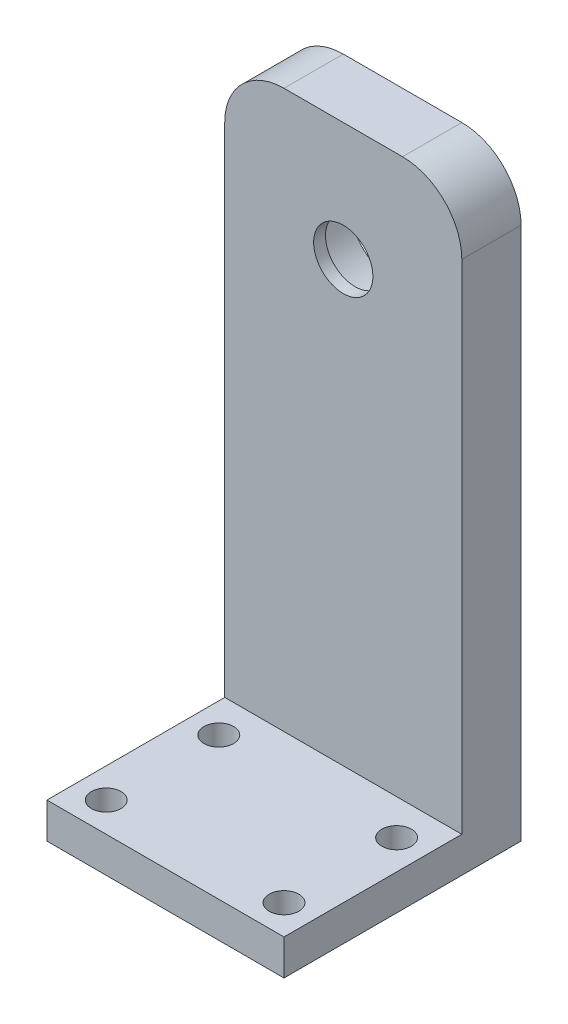
ISO-10303-21;
HEADER;
FILE_DESCRIPTION(('STEP AP214'),'2;1');
FILE_NAME('part.step','',(''),(''),'','','');
FILE_SCHEMA(('AUTOMOTIVE_DESIGN { 1 0 10303 214 1 1 1 1 }'));
ENDSEC;
DATA;
#1=APPLICATION_CONTEXT('core data for automotive mechanical design processes');
#2=APPLICATION_PROTOCOL_DEFINITION('international standard','automotive_design',2000,#1);
#3=PRODUCT_CONTEXT('',#1,'mechanical');
#4=PRODUCT('Part','Part','',(#3));
#5=PRODUCT_RELATED_PRODUCT_CATEGORY('part','',(#4));
#6=PRODUCT_DEFINITION_FORMATION('','',#4);
#7=PRODUCT_DEFINITION_CONTEXT('part definition',#1,'design');
#8=PRODUCT_DEFINITION('design','',#6,#7);
#9=PRODUCT_DEFINITION_SHAPE('','',#8);
#10=(LENGTH_UNIT() NAMED_UNIT(*) SI_UNIT(.MILLI.,.METRE.));
#11=(NAMED_UNIT(*) PLANE_ANGLE_UNIT() SI_UNIT($,.RADIAN.));
#12=(NAMED_UNIT(*) SI_UNIT($,.STERADIAN.) SOLID_ANGLE_UNIT());
#13=UNCERTAINTY_MEASURE_WITH_UNIT(LENGTH_MEASURE(1.E-05),#10,'distance_accuracy_value','');
#14=(GEOMETRIC_REPRESENTATION_CONTEXT(3) GLOBAL_UNCERTAINTY_ASSIGNED_CONTEXT((#13)) GLOBAL_UNIT_ASSIGNED_CONTEXT((#10,
#11,#12)) REPRESENTATION_CONTEXT('',''));
#15=CARTESIAN_POINT('',(0.,0.,0.));
#16=DIRECTION('',(0.,0.,1.));
#17=DIRECTION('',(1.,0.,0.));
#18=AXIS2_PLACEMENT_3D('',#15,#16,#17);
#19=CARTESIAN_POINT('',(0.,72.,0.));
#20=DIRECTION('',(0.,0.,1.));
#21=DIRECTION('',(1.,0.,0.));
#22=AXIS2_PLACEMENT_3D('',#19,#20,#21);
#23=CYLINDRICAL_SURFACE('',#22,9.5);
#24=CARTESIAN_POINT('',(0.,72.,0.));
#25=DIRECTION('',(0.,0.,1.));
#26=DIRECTION('',(1.,0.,0.));
#27=AXIS2_PLACEMENT_3D('',#24,#25,#26);
#28=CIRCLE('',#27,9.5);
#29=CARTESIAN_POINT('',(9.49999999999999,72.,0.));
#30=VERTEX_POINT('',#29);
#31=EDGE_CURVE('E179',#30,#30,#28,.T.);
#32=ORIENTED_EDGE('',*,*,#31,.F.);
#33=EDGE_LOOP('',(#32));
#34=FACE_BOUND('',#33,.T.);
#35=CARTESIAN_POINT('',(0.,72.,8.));
#36=DIRECTION('',(0.,0.,1.));
#37=DIRECTION('',(1.,0.,0.));
#38=AXIS2_PLACEMENT_3D('',#35,#36,#37);
#39=CIRCLE('',#38,9.5);
#40=CARTESIAN_POINT('',(9.49999999999999,72.,8.));
#41=VERTEX_POINT('',#40);
#42=EDGE_CURVE('E11',#41,#41,#39,.F.);
#43=ORIENTED_EDGE('',*,*,#42,.F.);
#44=EDGE_LOOP('',(#43));
#45=FACE_BOUND('',#44,.T.);
#46=ADVANCED_FACE('F33',(#34,#45),#23,.F.);
#47=CARTESIAN_POINT('',(-20.,15.,10.));
#48=DIRECTION('',(1.,0.,0.));
#49=DIRECTION('',(0.,1.,0.));
#50=AXIS2_PLACEMENT_3D('',#47,#48,#49);
#51=PLANE('',#50);
#52=DIRECTION('',(0.,-1.,0.));
#53=VECTOR('',#52,1.);
#54=CARTESIAN_POINT('',(-20.,15.,10.));
#55=LINE('',#54,#53);
#56=CARTESIAN_POINT('',(-20.,82.,10.));
#57=VERTEX_POINT('',#56);
#58=CARTESIAN_POINT('',(-20.,-2.,10.));
#59=VERTEX_POINT('',#58);
#60=EDGE_CURVE('E121',#57,#59,#55,.T.);
#61=ORIENTED_EDGE('',*,*,#60,.F.);
#62=DIRECTION('',(0.,0.,-1.));
#63=VECTOR('',#62,1.);
#64=CARTESIAN_POINT('',(-20.,82.,0.));
#65=LINE('',#64,#63);
#66=CARTESIAN_POINT('',(-20.,82.,0.));
#67=VERTEX_POINT('',#66);
#68=EDGE_CURVE('E145',#57,#67,#65,.T.);
#69=ORIENTED_EDGE('',*,*,#68,.T.);
#70=DIRECTION('',(0.,-1.,0.));
#71=VECTOR('',#70,1.);
#72=CARTESIAN_POINT('',(-20.,15.,0.));
#73=LINE('',#72,#71);
#74=CARTESIAN_POINT('',(-20.,-8.,0.));
#75=VERTEX_POINT('',#74);
#76=EDGE_CURVE('E122',#67,#75,#73,.T.);
#77=ORIENTED_EDGE('',*,*,#76,.T.);
#78=DIRECTION('',(0.,0.,1.));
#79=VECTOR('',#78,1.);
#80=CARTESIAN_POINT('',(-20.,-8.,0.));
#81=LINE('',#80,#79);
#82=CARTESIAN_POINT('',(-20.,-8.,40.));
#83=VERTEX_POINT('',#82);
#84=EDGE_CURVE('E106',#75,#83,#81,.T.);
#85=ORIENTED_EDGE('',*,*,#84,.T.);
#86=DIRECTION('',(0.,-1.,0.));
#87=VECTOR('',#86,1.);
#88=CARTESIAN_POINT('',(-20.,-10.,40.));
#89=LINE('',#88,#87);
#90=CARTESIAN_POINT('',(-20.,-2.,40.));
#91=VERTEX_POINT('',#90);
#92=EDGE_CURVE('E199',#91,#83,#89,.T.);
#93=ORIENTED_EDGE('',*,*,#92,.F.);
#94=DIRECTION('',(0.,0.,-1.));
#95=VECTOR('',#94,1.);
#96=CARTESIAN_POINT('',(-20.,-2.,40.));
#97=LINE('',#96,#95);
#98=EDGE_CURVE('E172',#91,#59,#97,.T.);
#99=ORIENTED_EDGE('',*,*,#98,.T.);
#100=EDGE_LOOP('',(#61,#69,#77,#85,#93,#99));
#101=FACE_BOUND('',#100,.T.);
#102=ADVANCED_FACE('F169',(#101),#51,.F.);
#103=CARTESIAN_POINT('',(20.,15.,10.));
#104=DIRECTION('',(-1.,0.,0.));
#105=DIRECTION('',(0.,-1.,0.));
#106=AXIS2_PLACEMENT_3D('',#103,#104,#105);
#107=PLANE('',#106);
#108=DIRECTION('',(0.,1.,0.));
#109=VECTOR('',#108,1.);
#110=CARTESIAN_POINT('',(20.,15.,0.));
#111=LINE('',#110,#109);
#112=CARTESIAN_POINT('',(20.,-8.,0.));
#113=VERTEX_POINT('',#112);
#114=CARTESIAN_POINT('',(20.,82.,0.));
#115=VERTEX_POINT('',#114);
#116=EDGE_CURVE('E114',#113,#115,#111,.T.);
#117=ORIENTED_EDGE('',*,*,#116,.T.);
#118=DIRECTION('',(0.,0.,-1.));
#119=VECTOR('',#118,1.);
#120=CARTESIAN_POINT('',(20.,82.,9.99999999999999));
#121=LINE('',#120,#119);
#122=CARTESIAN_POINT('',(20.,82.,10.));
#123=VERTEX_POINT('',#122);
#124=EDGE_CURVE('E41',#115,#123,#121,.F.);
#125=ORIENTED_EDGE('',*,*,#124,.T.);
#126=DIRECTION('',(0.,1.,0.));
#127=VECTOR('',#126,1.);
#128=CARTESIAN_POINT('',(20.,15.,10.));
#129=LINE('',#128,#127);
#130=CARTESIAN_POINT('',(20.,-2.,10.));
#131=VERTEX_POINT('',#130);
#132=EDGE_CURVE('E124',#131,#123,#129,.T.);
#133=ORIENTED_EDGE('',*,*,#132,.F.);
#134=DIRECTION('',(0.,0.,-1.));
#135=VECTOR('',#134,1.);
#136=CARTESIAN_POINT('',(20.,-2.,40.));
#137=LINE('',#136,#135);
#138=CARTESIAN_POINT('',(20.,-2.,40.));
#139=VERTEX_POINT('',#138);
#140=EDGE_CURVE('E126',#139,#131,#137,.T.);
#141=ORIENTED_EDGE('',*,*,#140,.F.);
#142=DIRECTION('',(0.,1.,0.));
#143=VECTOR('',#142,1.);
#144=CARTESIAN_POINT('',(20.,-10.,40.));
#145=LINE('',#144,#143);
#146=CARTESIAN_POINT('',(20.,-8.,40.));
#147=VERTEX_POINT('',#146);
#148=EDGE_CURVE('E116',#147,#139,#145,.T.);
#149=ORIENTED_EDGE('',*,*,#148,.F.);
#150=DIRECTION('',(0.,0.,1.));
#151=VECTOR('',#150,1.);
#152=CARTESIAN_POINT('',(20.,-8.,0.));
#153=LINE('',#152,#151);
#154=EDGE_CURVE('E104',#113,#147,#153,.T.);
#155=ORIENTED_EDGE('',*,*,#154,.F.);
#156=EDGE_LOOP('',(#117,#125,#133,#141,#149,#155));
#157=FACE_BOUND('',#156,.T.);
#158=ADVANCED_FACE('F113',(#157),#107,.F.);
#159=CARTESIAN_POINT('',(0.,0.,10.));
#160=DIRECTION('',(0.,0.,1.));
#161=DIRECTION('',(1.,0.,0.));
#162=AXIS2_PLACEMENT_3D('',#159,#160,#161);
#163=PLANE('',#162);
#164=DIRECTION('',(1.,0.,0.));
#165=VECTOR('',#164,1.);
#166=CARTESIAN_POINT('',(20.,92.,9.99999999999999));
#167=LINE('',#166,#165);
#168=CARTESIAN_POINT('',(-10.,92.,9.99999999999999));
#169=VERTEX_POINT('',#168);
#170=CARTESIAN_POINT('',(9.99999999999998,92.,9.99999999999999));
#171=VERTEX_POINT('',#170);
#172=EDGE_CURVE('E163',#169,#171,#167,.T.);
#173=ORIENTED_EDGE('',*,*,#172,.F.);
#174=CARTESIAN_POINT('',(-10.,82.,10.));
#175=DIRECTION('',(0.,0.,1.));
#176=DIRECTION('',(1.,0.,0.));
#177=AXIS2_PLACEMENT_3D('',#174,#175,#176);
#178=CIRCLE('',#177,10.);
#179=EDGE_CURVE('E157',#169,#57,#178,.T.);
#180=ORIENTED_EDGE('',*,*,#179,.T.);
#181=ORIENTED_EDGE('',*,*,#60,.T.);
#182=DIRECTION('',(-1.,0.,0.));
#183=VECTOR('',#182,1.);
#184=CARTESIAN_POINT('',(-20.,-2.,10.));
#185=LINE('',#184,#183);
#186=EDGE_CURVE('E197',#131,#59,#185,.T.);
#187=ORIENTED_EDGE('',*,*,#186,.F.);
#188=ORIENTED_EDGE('',*,*,#132,.T.);
#189=CARTESIAN_POINT('',(9.99999999999998,82.,9.99999999999999));
#190=DIRECTION('',(0.,0.,1.));
#191=DIRECTION('',(1.,0.,0.));
#192=AXIS2_PLACEMENT_3D('',#189,#190,#191);
#193=CIRCLE('',#192,10.);
#194=EDGE_CURVE('E54',#123,#171,#193,.T.);
#195=ORIENTED_EDGE('',*,*,#194,.T.);
#196=EDGE_LOOP('',(#173,#180,#181,#187,#188,#195));
#197=FACE_BOUND('',#196,.T.);
#198=CARTESIAN_POINT('',(0.,72.,10.));
#199=DIRECTION('',(0.,0.,1.));
#200=DIRECTION('',(1.,0.,0.));
#201=AXIS2_PLACEMENT_3D('',#198,#199,#200);
#202=CIRCLE('',#201,5.);
#203=CARTESIAN_POINT('',(5.,72.,10.));
#204=VERTEX_POINT('',#203);
#205=EDGE_CURVE('E349',#204,#204,#202,.T.);
#206=ORIENTED_EDGE('',*,*,#205,.F.);
#207=EDGE_LOOP('',(#206));
#208=FACE_BOUND('',#207,.T.);
#209=ADVANCED_FACE('F160',(#197,#208),#163,.T.);
#210=CARTESIAN_POINT('',(0.,0.,0.));
#211=DIRECTION('',(0.,0.,1.));
#212=DIRECTION('',(1.,0.,0.));
#213=AXIS2_PLACEMENT_3D('',#210,#211,#212);
#214=PLANE('',#213);
#215=ORIENTED_EDGE('',*,*,#31,.T.);
#216=EDGE_LOOP('',(#215));
#217=FACE_BOUND('',#216,.T.);
#218=ORIENTED_EDGE('',*,*,#76,.F.);
#219=CARTESIAN_POINT('',(-10.,82.,0.));
#220=DIRECTION('',(0.,0.,1.));
#221=DIRECTION('',(1.,0.,0.));
#222=AXIS2_PLACEMENT_3D('',#219,#220,#221);
#223=CIRCLE('',#222,10.);
#224=CARTESIAN_POINT('',(-10.,92.,0.));
#225=VERTEX_POINT('',#224);
#226=EDGE_CURVE('E149',#67,#225,#223,.F.);
#227=ORIENTED_EDGE('',*,*,#226,.T.);
#228=DIRECTION('',(1.,0.,0.));
#229=VECTOR('',#228,1.);
#230=CARTESIAN_POINT('',(20.,92.,0.));
#231=LINE('',#230,#229);
#232=CARTESIAN_POINT('',(9.99999999999998,92.,0.));
#233=VERTEX_POINT('',#232);
#234=EDGE_CURVE('E175',#225,#233,#231,.T.);
#235=ORIENTED_EDGE('',*,*,#234,.T.);
#236=CARTESIAN_POINT('',(9.99999999999998,82.,0.));
#237=DIRECTION('',(0.,0.,1.));
#238=DIRECTION('',(1.,0.,0.));
#239=AXIS2_PLACEMENT_3D('',#236,#237,#238);
#240=CIRCLE('',#239,10.);
#241=EDGE_CURVE('E120',#233,#115,#240,.F.);
#242=ORIENTED_EDGE('',*,*,#241,.T.);
#243=ORIENTED_EDGE('',*,*,#116,.F.);
#244=DIRECTION('',(-1.,0.,0.));
#245=VECTOR('',#244,1.);
#246=CARTESIAN_POINT('',(-20.,-8.,0.));
#247=LINE('',#246,#245);
#248=EDGE_CURVE('E100',#113,#75,#247,.T.);
#249=ORIENTED_EDGE('',*,*,#248,.T.);
#250=EDGE_LOOP('',(#218,#227,#235,#242,#243,#249));
#251=FACE_BOUND('',#250,.T.);
#252=ADVANCED_FACE('F118',(#217,#251),#214,.F.);
#253=CARTESIAN_POINT('',(-20.,-2.,40.));
#254=DIRECTION('',(0.,-1.,0.));
#255=DIRECTION('',(0.,0.,-1.));
#256=AXIS2_PLACEMENT_3D('',#253,#254,#255);
#257=PLANE('',#256);
#258=CARTESIAN_POINT('',(-15.,-2.,16.));
#259=DIRECTION('',(0.,1.,0.));
#260=DIRECTION('',(0.,0.,1.));
#261=AXIS2_PLACEMENT_3D('',#258,#259,#260);
#262=CIRCLE('',#261,2.5);
#263=CARTESIAN_POINT('',(-15.,-2.,18.5));
#264=VERTEX_POINT('',#263);
#265=EDGE_CURVE('E141',#264,#264,#262,.T.);
#266=ORIENTED_EDGE('',*,*,#265,.F.);
#267=EDGE_LOOP('',(#266));
#268=FACE_BOUND('',#267,.T.);
#269=CARTESIAN_POINT('',(15.,-2.,16.));
#270=DIRECTION('',(0.,1.,0.));
#271=DIRECTION('',(0.,0.,1.));
#272=AXIS2_PLACEMENT_3D('',#269,#270,#271);
#273=CIRCLE('',#272,2.5);
#274=CARTESIAN_POINT('',(15.,-2.,18.5));
#275=VERTEX_POINT('',#274);
#276=EDGE_CURVE('E181',#275,#275,#273,.T.);
#277=ORIENTED_EDGE('',*,*,#276,.F.);
#278=EDGE_LOOP('',(#277));
#279=FACE_BOUND('',#278,.T.);
#280=CARTESIAN_POINT('',(-15.,-2.,35.));
#281=DIRECTION('',(0.,1.,0.));
#282=DIRECTION('',(0.,0.,1.));
#283=AXIS2_PLACEMENT_3D('',#280,#281,#282);
#284=CIRCLE('',#283,2.5);
#285=CARTESIAN_POINT('',(-15.,-2.,37.5));
#286=VERTEX_POINT('',#285);
#287=EDGE_CURVE('E134',#286,#286,#284,.T.);
#288=ORIENTED_EDGE('',*,*,#287,.F.);
#289=EDGE_LOOP('',(#288));
#290=FACE_BOUND('',#289,.T.);
#291=CARTESIAN_POINT('',(15.,-2.,35.));
#292=DIRECTION('',(0.,1.,0.));
#293=DIRECTION('',(0.,0.,1.));
#294=AXIS2_PLACEMENT_3D('',#291,#292,#293);
#295=CIRCLE('',#294,2.5);
#296=CARTESIAN_POINT('',(15.,-2.,37.5));
#297=VERTEX_POINT('',#296);
#298=EDGE_CURVE('E144',#297,#297,#295,.T.);
#299=ORIENTED_EDGE('',*,*,#298,.F.);
#300=EDGE_LOOP('',(#299));
#301=FACE_BOUND('',#300,.T.);
#302=ORIENTED_EDGE('',*,*,#186,.T.);
#303=ORIENTED_EDGE('',*,*,#98,.F.);
#304=DIRECTION('',(-1.,0.,0.));
#305=VECTOR('',#304,1.);
#306=CARTESIAN_POINT('',(-20.,-2.,40.));
#307=LINE('',#306,#305);
#308=EDGE_CURVE('E203',#139,#91,#307,.T.);
#309=ORIENTED_EDGE('',*,*,#308,.F.);
#310=ORIENTED_EDGE('',*,*,#140,.T.);
#311=EDGE_LOOP('',(#302,#303,#309,#310));
#312=FACE_BOUND('',#311,.T.);
#313=ADVANCED_FACE('F253',(#268,#279,#290,#301,#312),#257,.F.);
#314=CARTESIAN_POINT('',(0.,0.,40.));
#315=DIRECTION('',(0.,0.,-1.));
#316=DIRECTION('',(-1.,0.,0.));
#317=AXIS2_PLACEMENT_3D('',#314,#315,#316);
#318=PLANE('',#317);
#319=ORIENTED_EDGE('',*,*,#92,.T.);
#320=DIRECTION('',(-1.,0.,0.));
#321=VECTOR('',#320,1.);
#322=CARTESIAN_POINT('',(-20.,-8.,40.));
#323=LINE('',#322,#321);
#324=EDGE_CURVE('E110',#147,#83,#323,.T.);
#325=ORIENTED_EDGE('',*,*,#324,.F.);
#326=ORIENTED_EDGE('',*,*,#148,.T.);
#327=ORIENTED_EDGE('',*,*,#308,.T.);
#328=EDGE_LOOP('',(#319,#325,#326,#327));
#329=FACE_BOUND('',#328,.T.);
#330=ADVANCED_FACE('F249',(#329),#318,.F.);
#331=CARTESIAN_POINT('',(-20.,-8.,0.));
#332=DIRECTION('',(0.,1.,0.));
#333=DIRECTION('',(0.,0.,1.));
#334=AXIS2_PLACEMENT_3D('',#331,#332,#333);
#335=PLANE('',#334);
#336=CARTESIAN_POINT('',(-15.,-8.,16.));
#337=DIRECTION('',(0.,1.,0.));
#338=DIRECTION('',(0.,0.,1.));
#339=AXIS2_PLACEMENT_3D('',#336,#337,#338);
#340=CIRCLE('',#339,2.5);
#341=CARTESIAN_POINT('',(-15.,-8.,18.5));
#342=VERTEX_POINT('',#341);
#343=EDGE_CURVE('E140',#342,#342,#340,.T.);
#344=ORIENTED_EDGE('',*,*,#343,.T.);
#345=EDGE_LOOP('',(#344));
#346=FACE_BOUND('',#345,.T.);
#347=CARTESIAN_POINT('',(15.,-8.,16.));
#348=DIRECTION('',(0.,1.,0.));
#349=DIRECTION('',(0.,0.,1.));
#350=AXIS2_PLACEMENT_3D('',#347,#348,#349);
#351=CIRCLE('',#350,2.5);
#352=CARTESIAN_POINT('',(15.,-8.,18.5));
#353=VERTEX_POINT('',#352);
#354=EDGE_CURVE('E137',#353,#353,#351,.T.);
#355=ORIENTED_EDGE('',*,*,#354,.T.);
#356=EDGE_LOOP('',(#355));
#357=FACE_BOUND('',#356,.T.);
#358=CARTESIAN_POINT('',(-15.,-8.,35.));
#359=DIRECTION('',(0.,1.,0.));
#360=DIRECTION('',(0.,0.,1.));
#361=AXIS2_PLACEMENT_3D('',#358,#359,#360);
#362=CIRCLE('',#361,2.5);
#363=CARTESIAN_POINT('',(-15.,-8.,37.5));
#364=VERTEX_POINT('',#363);
#365=EDGE_CURVE('E133',#364,#364,#362,.T.);
#366=ORIENTED_EDGE('',*,*,#365,.T.);
#367=EDGE_LOOP('',(#366));
#368=FACE_BOUND('',#367,.T.);
#369=CARTESIAN_POINT('',(15.,-8.,35.));
#370=DIRECTION('',(0.,1.,0.));
#371=DIRECTION('',(0.,0.,1.));
#372=AXIS2_PLACEMENT_3D('',#369,#370,#371);
#373=CIRCLE('',#372,2.5);
#374=CARTESIAN_POINT('',(15.,-8.,37.5));
#375=VERTEX_POINT('',#374);
#376=EDGE_CURVE('E130',#375,#375,#373,.T.);
#377=ORIENTED_EDGE('',*,*,#376,.T.);
#378=EDGE_LOOP('',(#377));
#379=FACE_BOUND('',#378,.T.);
#380=ORIENTED_EDGE('',*,*,#324,.T.);
#381=ORIENTED_EDGE('',*,*,#84,.F.);
#382=ORIENTED_EDGE('',*,*,#248,.F.);
#383=ORIENTED_EDGE('',*,*,#154,.T.);
#384=EDGE_LOOP('',(#380,#381,#382,#383));
#385=FACE_BOUND('',#384,.T.);
#386=ADVANCED_FACE('F103',(#346,#357,#368,#379,#385),#335,.F.);
#387=CARTESIAN_POINT('',(15.,-17.,35.));
#388=DIRECTION('',(0.,1.,0.));
#389=DIRECTION('',(0.,0.,1.));
#390=AXIS2_PLACEMENT_3D('',#387,#388,#389);
#391=CYLINDRICAL_SURFACE('',#390,2.5);
#392=ORIENTED_EDGE('',*,*,#298,.T.);
#393=EDGE_LOOP('',(#392));
#394=FACE_BOUND('',#393,.T.);
#395=ORIENTED_EDGE('',*,*,#376,.F.);
#396=EDGE_LOOP('',(#395));
#397=FACE_BOUND('',#396,.T.);
#398=ADVANCED_FACE('F242',(#394,#397),#391,.F.);
#399=CARTESIAN_POINT('',(-15.,-17.,35.));
#400=DIRECTION('',(0.,1.,0.));
#401=DIRECTION('',(0.,0.,1.));
#402=AXIS2_PLACEMENT_3D('',#399,#400,#401);
#403=CYLINDRICAL_SURFACE('',#402,2.5);
#404=ORIENTED_EDGE('',*,*,#287,.T.);
#405=EDGE_LOOP('',(#404));
#406=FACE_BOUND('',#405,.T.);
#407=ORIENTED_EDGE('',*,*,#365,.F.);
#408=EDGE_LOOP('',(#407));
#409=FACE_BOUND('',#408,.T.);
#410=ADVANCED_FACE('F238',(#406,#409),#403,.F.);
#411=CARTESIAN_POINT('',(15.,-17.,16.));
#412=DIRECTION('',(0.,1.,0.));
#413=DIRECTION('',(0.,0.,1.));
#414=AXIS2_PLACEMENT_3D('',#411,#412,#413);
#415=CYLINDRICAL_SURFACE('',#414,2.5);
#416=ORIENTED_EDGE('',*,*,#276,.T.);
#417=EDGE_LOOP('',(#416));
#418=FACE_BOUND('',#417,.T.);
#419=ORIENTED_EDGE('',*,*,#354,.F.);
#420=EDGE_LOOP('',(#419));
#421=FACE_BOUND('',#420,.T.);
#422=ADVANCED_FACE('F234',(#418,#421),#415,.F.);
#423=CARTESIAN_POINT('',(-15.,-17.,16.));
#424=DIRECTION('',(0.,1.,0.));
#425=DIRECTION('',(0.,0.,1.));
#426=AXIS2_PLACEMENT_3D('',#423,#424,#425);
#427=CYLINDRICAL_SURFACE('',#426,2.5);
#428=ORIENTED_EDGE('',*,*,#265,.T.);
#429=EDGE_LOOP('',(#428));
#430=FACE_BOUND('',#429,.T.);
#431=ORIENTED_EDGE('',*,*,#343,.F.);
#432=EDGE_LOOP('',(#431));
#433=FACE_BOUND('',#432,.T.);
#434=ADVANCED_FACE('F231',(#430,#433),#427,.F.);
#435=CARTESIAN_POINT('',(20.,92.,117.70329614269));
#436=DIRECTION('',(0.,1.,0.));
#437=DIRECTION('',(0.,0.,1.));
#438=AXIS2_PLACEMENT_3D('',#435,#436,#437);
#439=PLANE('',#438);
#440=ORIENTED_EDGE('',*,*,#234,.F.);
#441=DIRECTION('',(0.,0.,-1.));
#442=VECTOR('',#441,1.);
#443=CARTESIAN_POINT('',(-10.,92.,9.99999999999999));
#444=LINE('',#443,#442);
#445=EDGE_CURVE('E154',#225,#169,#444,.F.);
#446=ORIENTED_EDGE('',*,*,#445,.T.);
#447=ORIENTED_EDGE('',*,*,#172,.T.);
#448=DIRECTION('',(0.,0.,-1.));
#449=VECTOR('',#448,1.);
#450=CARTESIAN_POINT('',(9.99999999999998,92.,0.));
#451=LINE('',#450,#449);
#452=EDGE_CURVE('E151',#171,#233,#451,.T.);
#453=ORIENTED_EDGE('',*,*,#452,.T.);
#454=EDGE_LOOP('',(#440,#446,#447,#453));
#455=FACE_BOUND('',#454,.T.);
#456=ADVANCED_FACE('F177',(#455),#439,.T.);
#457=CARTESIAN_POINT('',(-10.,82.,10.));
#458=DIRECTION('',(0.,0.,1.));
#459=DIRECTION('',(1.,0.,0.));
#460=AXIS2_PLACEMENT_3D('',#457,#458,#459);
#461=CYLINDRICAL_SURFACE('',#460,10.);
#462=ORIENTED_EDGE('',*,*,#179,.F.);
#463=ORIENTED_EDGE('',*,*,#445,.F.);
#464=ORIENTED_EDGE('',*,*,#226,.F.);
#465=ORIENTED_EDGE('',*,*,#68,.F.);
#466=EDGE_LOOP('',(#462,#463,#464,#465));
#467=FACE_BOUND('',#466,.T.);
#468=ADVANCED_FACE('F173',(#467),#461,.T.);
#469=CARTESIAN_POINT('',(9.99999999999998,82.,117.70329614269));
#470=DIRECTION('',(0.,0.,1.));
#471=DIRECTION('',(1.,0.,0.));
#472=AXIS2_PLACEMENT_3D('',#469,#470,#471);
#473=CYLINDRICAL_SURFACE('',#472,10.);
#474=ORIENTED_EDGE('',*,*,#194,.F.);
#475=ORIENTED_EDGE('',*,*,#124,.F.);
#476=ORIENTED_EDGE('',*,*,#241,.F.);
#477=ORIENTED_EDGE('',*,*,#452,.F.);
#478=EDGE_LOOP('',(#474,#475,#476,#477));
#479=FACE_BOUND('',#478,.T.);
#480=ADVANCED_FACE('F35',(#479),#473,.T.);
#481=CARTESIAN_POINT('',(0.,72.,8.));
#482=DIRECTION('',(0.,0.,1.));
#483=DIRECTION('',(1.,0.,0.));
#484=AXIS2_PLACEMENT_3D('',#481,#482,#483);
#485=PLANE('',#484);
#486=CARTESIAN_POINT('',(0.,72.,8.));
#487=DIRECTION('',(0.,0.,1.));
#488=DIRECTION('',(1.,0.,0.));
#489=AXIS2_PLACEMENT_3D('',#486,#487,#488);
#490=CIRCLE('',#489,5.);
#491=CARTESIAN_POINT('',(5.,72.,8.));
#492=VERTEX_POINT('',#491);
#493=EDGE_CURVE('E184',#492,#492,#490,.T.);
#494=ORIENTED_EDGE('',*,*,#493,.T.);
#495=EDGE_LOOP('',(#494));
#496=FACE_BOUND('',#495,.T.);
#497=ORIENTED_EDGE('',*,*,#42,.T.);
#498=EDGE_LOOP('',(#497));
#499=FACE_BOUND('',#498,.T.);
#500=ADVANCED_FACE('F210',(#496,#499),#485,.F.);
#501=CARTESIAN_POINT('',(0.,72.,8.));
#502=DIRECTION('',(0.,0.,1.));
#503=DIRECTION('',(1.,0.,0.));
#504=AXIS2_PLACEMENT_3D('',#501,#502,#503);
#505=CYLINDRICAL_SURFACE('',#504,5.);
#506=ORIENTED_EDGE('',*,*,#493,.F.);
#507=EDGE_LOOP('',(#506));
#508=FACE_BOUND('',#507,.T.);
#509=ORIENTED_EDGE('',*,*,#205,.T.);
#510=EDGE_LOOP('',(#509));
#511=FACE_BOUND('',#510,.T.);
#512=ADVANCED_FACE('F215',(#508,#511),#505,.F.);
#513=CLOSED_SHELL('',(#46,#102,#158,#209,#252,#313,#330,#386,#398,#410,#422,#434,#456,#468,#480,
#500,#512));
#514=MANIFOLD_SOLID_BREP('B2',#513);
#515=ADVANCED_BREP_SHAPE_REPRESENTATION('',(#18,#514),#14);
#516=SHAPE_DEFINITION_REPRESENTATION(#9,#515);
ENDSEC;
END-ISO-10303-21;
